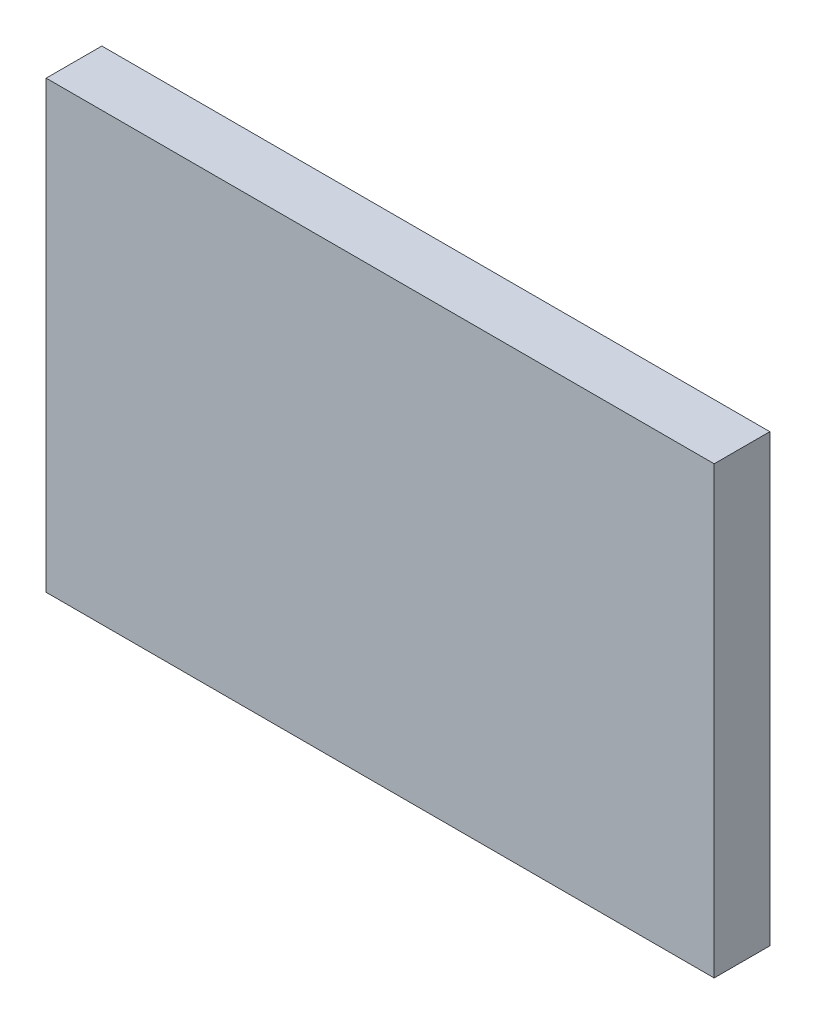
ISO-10303-21;
HEADER;
FILE_DESCRIPTION(('STEP AP214'),'2;1');
FILE_NAME('part.step','',(''),(''),'','','');
FILE_SCHEMA(('AUTOMOTIVE_DESIGN { 1 0 10303 214 1 1 1 1 }'));
ENDSEC;
DATA;
#1=APPLICATION_CONTEXT('core data for automotive mechanical design processes');
#2=APPLICATION_PROTOCOL_DEFINITION('international standard','automotive_design',2000,#1);
#3=PRODUCT_CONTEXT('',#1,'mechanical');
#4=PRODUCT('Part','Part','',(#3));
#5=PRODUCT_RELATED_PRODUCT_CATEGORY('part','',(#4));
#6=PRODUCT_DEFINITION_FORMATION('','',#4);
#7=PRODUCT_DEFINITION_CONTEXT('part definition',#1,'design');
#8=PRODUCT_DEFINITION('design','',#6,#7);
#9=PRODUCT_DEFINITION_SHAPE('','',#8);
#10=(LENGTH_UNIT() NAMED_UNIT(*) SI_UNIT(.MILLI.,.METRE.));
#11=(NAMED_UNIT(*) PLANE_ANGLE_UNIT() SI_UNIT($,.RADIAN.));
#12=(NAMED_UNIT(*) SI_UNIT($,.STERADIAN.) SOLID_ANGLE_UNIT());
#13=UNCERTAINTY_MEASURE_WITH_UNIT(LENGTH_MEASURE(1.E-05),#10,'distance_accuracy_value','');
#14=(GEOMETRIC_REPRESENTATION_CONTEXT(3) GLOBAL_UNCERTAINTY_ASSIGNED_CONTEXT((#13)) GLOBAL_UNIT_ASSIGNED_CONTEXT((#10,
#11,#12)) REPRESENTATION_CONTEXT('',''));
#15=CARTESIAN_POINT('',(0.,0.,0.));
#16=DIRECTION('',(0.,0.,1.));
#17=DIRECTION('',(1.,0.,0.));
#18=AXIS2_PLACEMENT_3D('',#15,#16,#17);
#19=CARTESIAN_POINT('',(0.,0.,12.7));
#20=DIRECTION('',(1.,0.,0.));
#21=DIRECTION('',(0.,0.,-1.));
#22=AXIS2_PLACEMENT_3D('',#19,#20,#21);
#23=PLANE('',#22);
#24=DIRECTION('',(0.,-1.,0.));
#25=VECTOR('',#24,1.);
#26=CARTESIAN_POINT('',(0.,0.,0.));
#27=LINE('',#26,#25);
#28=CARTESIAN_POINT('',(0.,101.6,0.));
#29=VERTEX_POINT('',#28);
#30=CARTESIAN_POINT('',(0.,0.,0.));
#31=VERTEX_POINT('',#30);
#32=EDGE_CURVE('E105',#29,#31,#27,.T.);
#33=ORIENTED_EDGE('',*,*,#32,.T.);
#34=DIRECTION('',(0.,0.,-1.));
#35=VECTOR('',#34,1.);
#36=CARTESIAN_POINT('',(0.,0.,12.7));
#37=LINE('',#36,#35);
#38=CARTESIAN_POINT('',(0.,0.,12.7));
#39=VERTEX_POINT('',#38);
#40=EDGE_CURVE('E11',#39,#31,#37,.T.);
#41=ORIENTED_EDGE('',*,*,#40,.F.);
#42=DIRECTION('',(0.,-1.,0.));
#43=VECTOR('',#42,1.);
#44=CARTESIAN_POINT('',(0.,0.,12.7));
#45=LINE('',#44,#43);
#46=CARTESIAN_POINT('',(0.,101.6,12.7));
#47=VERTEX_POINT('',#46);
#48=EDGE_CURVE('E89',#47,#39,#45,.T.);
#49=ORIENTED_EDGE('',*,*,#48,.F.);
#50=DIRECTION('',(0.,0.,-1.));
#51=VECTOR('',#50,1.);
#52=CARTESIAN_POINT('',(0.,101.6,12.7));
#53=LINE('',#52,#51);
#54=EDGE_CURVE('E98',#47,#29,#53,.T.);
#55=ORIENTED_EDGE('',*,*,#54,.T.);
#56=EDGE_LOOP('',(#33,#41,#49,#55));
#57=FACE_BOUND('',#56,.T.);
#58=ADVANCED_FACE('F39',(#57),#23,.F.);
#59=CARTESIAN_POINT('',(0.,0.,12.7));
#60=DIRECTION('',(0.,1.,0.));
#61=DIRECTION('',(0.,0.,1.));
#62=AXIS2_PLACEMENT_3D('',#59,#60,#61);
#63=PLANE('',#62);
#64=DIRECTION('',(1.,0.,0.));
#65=VECTOR('',#64,1.);
#66=CARTESIAN_POINT('',(0.,0.,0.));
#67=LINE('',#66,#65);
#68=CARTESIAN_POINT('',(152.4,0.,0.));
#69=VERTEX_POINT('',#68);
#70=EDGE_CURVE('E94',#31,#69,#67,.T.);
#71=ORIENTED_EDGE('',*,*,#70,.T.);
#72=DIRECTION('',(0.,0.,-1.));
#73=VECTOR('',#72,1.);
#74=CARTESIAN_POINT('',(152.4,0.,12.7));
#75=LINE('',#74,#73);
#76=CARTESIAN_POINT('',(152.4,0.,12.7));
#77=VERTEX_POINT('',#76);
#78=EDGE_CURVE('E50',#77,#69,#75,.T.);
#79=ORIENTED_EDGE('',*,*,#78,.F.);
#80=DIRECTION('',(1.,0.,0.));
#81=VECTOR('',#80,1.);
#82=CARTESIAN_POINT('',(0.,0.,12.7));
#83=LINE('',#82,#81);
#84=EDGE_CURVE('E81',#39,#77,#83,.T.);
#85=ORIENTED_EDGE('',*,*,#84,.F.);
#86=ORIENTED_EDGE('',*,*,#40,.T.);
#87=EDGE_LOOP('',(#71,#79,#85,#86));
#88=FACE_BOUND('',#87,.T.);
#89=ADVANCED_FACE('F91',(#88),#63,.F.);
#90=CARTESIAN_POINT('',(152.4,0.,12.7));
#91=DIRECTION('',(-1.,0.,0.));
#92=DIRECTION('',(0.,0.,1.));
#93=AXIS2_PLACEMENT_3D('',#90,#91,#92);
#94=PLANE('',#93);
#95=DIRECTION('',(0.,1.,0.));
#96=VECTOR('',#95,1.);
#97=CARTESIAN_POINT('',(152.4,0.,0.));
#98=LINE('',#97,#96);
#99=CARTESIAN_POINT('',(152.4,101.6,0.));
#100=VERTEX_POINT('',#99);
#101=EDGE_CURVE('E75',#69,#100,#98,.T.);
#102=ORIENTED_EDGE('',*,*,#101,.T.);
#103=DIRECTION('',(0.,0.,-1.));
#104=VECTOR('',#103,1.);
#105=CARTESIAN_POINT('',(152.4,101.6,12.7));
#106=LINE('',#105,#104);
#107=CARTESIAN_POINT('',(152.4,101.6,12.7));
#108=VERTEX_POINT('',#107);
#109=EDGE_CURVE('E92',#108,#100,#106,.T.);
#110=ORIENTED_EDGE('',*,*,#109,.F.);
#111=DIRECTION('',(0.,1.,0.));
#112=VECTOR('',#111,1.);
#113=CARTESIAN_POINT('',(152.4,0.,12.7));
#114=LINE('',#113,#112);
#115=EDGE_CURVE('E86',#77,#108,#114,.T.);
#116=ORIENTED_EDGE('',*,*,#115,.F.);
#117=ORIENTED_EDGE('',*,*,#78,.T.);
#118=EDGE_LOOP('',(#102,#110,#116,#117));
#119=FACE_BOUND('',#118,.T.);
#120=ADVANCED_FACE('F96',(#119),#94,.F.);
#121=CARTESIAN_POINT('',(0.,101.6,12.7));
#122=DIRECTION('',(0.,-1.,0.));
#123=DIRECTION('',(0.,0.,-1.));
#124=AXIS2_PLACEMENT_3D('',#121,#122,#123);
#125=PLANE('',#124);
#126=DIRECTION('',(-1.,0.,0.));
#127=VECTOR('',#126,1.);
#128=CARTESIAN_POINT('',(0.,101.6,0.));
#129=LINE('',#128,#127);
#130=EDGE_CURVE('E77',#100,#29,#129,.T.);
#131=ORIENTED_EDGE('',*,*,#130,.T.);
#132=ORIENTED_EDGE('',*,*,#54,.F.);
#133=DIRECTION('',(-1.,0.,0.));
#134=VECTOR('',#133,1.);
#135=CARTESIAN_POINT('',(0.,101.6,12.7));
#136=LINE('',#135,#134);
#137=EDGE_CURVE('E54',#108,#47,#136,.T.);
#138=ORIENTED_EDGE('',*,*,#137,.F.);
#139=ORIENTED_EDGE('',*,*,#109,.T.);
#140=EDGE_LOOP('',(#131,#132,#138,#139));
#141=FACE_BOUND('',#140,.T.);
#142=ADVANCED_FACE('F108',(#141),#125,.F.);
#143=CARTESIAN_POINT('',(0.,0.,12.7));
#144=DIRECTION('',(0.,0.,-1.));
#145=DIRECTION('',(-1.,0.,0.));
#146=AXIS2_PLACEMENT_3D('',#143,#144,#145);
#147=PLANE('',#146);
#148=ORIENTED_EDGE('',*,*,#48,.T.);
#149=ORIENTED_EDGE('',*,*,#84,.T.);
#150=ORIENTED_EDGE('',*,*,#115,.T.);
#151=ORIENTED_EDGE('',*,*,#137,.T.);
#152=EDGE_LOOP('',(#148,#149,#150,#151));
#153=FACE_BOUND('',#152,.T.);
#154=ADVANCED_FACE('F88',(#153),#147,.F.);
#155=CARTESIAN_POINT('',(0.,0.,0.));
#156=DIRECTION('',(0.,0.,-1.));
#157=DIRECTION('',(-1.,0.,0.));
#158=AXIS2_PLACEMENT_3D('',#155,#156,#157);
#159=PLANE('',#158);
#160=ORIENTED_EDGE('',*,*,#32,.F.);
#161=ORIENTED_EDGE('',*,*,#130,.F.);
#162=ORIENTED_EDGE('',*,*,#101,.F.);
#163=ORIENTED_EDGE('',*,*,#70,.F.);
#164=EDGE_LOOP('',(#160,#161,#162,#163));
#165=FACE_BOUND('',#164,.T.);
#166=ADVANCED_FACE('F115',(#165),#159,.T.);
#167=CLOSED_SHELL('',(#58,#89,#120,#142,#154,#166));
#168=MANIFOLD_SOLID_BREP('B2',#167);
#169=ADVANCED_BREP_SHAPE_REPRESENTATION('',(#18,#168),#14);
#170=SHAPE_DEFINITION_REPRESENTATION(#9,#169);
ENDSEC;
END-ISO-10303-21;
